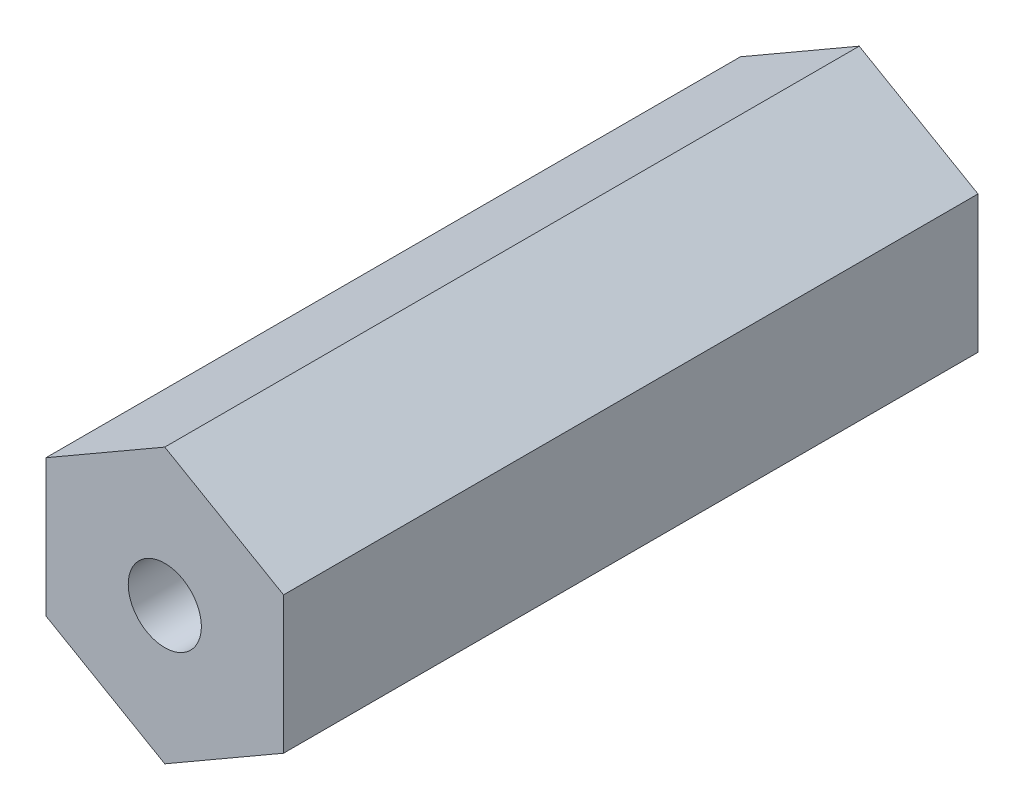
ISO-10303-21;
HEADER;
FILE_DESCRIPTION(('STEP AP214'),'2;1');
FILE_NAME('part.step','',(''),(''),'','','');
FILE_SCHEMA(('AUTOMOTIVE_DESIGN { 1 0 10303 214 1 1 1 1 }'));
ENDSEC;
DATA;
#1=APPLICATION_CONTEXT('core data for automotive mechanical design processes');
#2=APPLICATION_PROTOCOL_DEFINITION('international standard','automotive_design',2000,#1);
#3=PRODUCT_CONTEXT('',#1,'mechanical');
#4=PRODUCT('Part','Part','',(#3));
#5=PRODUCT_RELATED_PRODUCT_CATEGORY('part','',(#4));
#6=PRODUCT_DEFINITION_FORMATION('','',#4);
#7=PRODUCT_DEFINITION_CONTEXT('part definition',#1,'design');
#8=PRODUCT_DEFINITION('design','',#6,#7);
#9=PRODUCT_DEFINITION_SHAPE('','',#8);
#10=(LENGTH_UNIT() NAMED_UNIT(*) SI_UNIT(.MILLI.,.METRE.));
#11=(NAMED_UNIT(*) PLANE_ANGLE_UNIT() SI_UNIT($,.RADIAN.));
#12=(NAMED_UNIT(*) SI_UNIT($,.STERADIAN.) SOLID_ANGLE_UNIT());
#13=UNCERTAINTY_MEASURE_WITH_UNIT(LENGTH_MEASURE(1.E-05),#10,'distance_accuracy_value','');
#14=(GEOMETRIC_REPRESENTATION_CONTEXT(3) GLOBAL_UNCERTAINTY_ASSIGNED_CONTEXT((#13)) GLOBAL_UNIT_ASSIGNED_CONTEXT((#10,
#11,#12)) REPRESENTATION_CONTEXT('',''));
#15=CARTESIAN_POINT('',(0.,0.,0.));
#16=DIRECTION('',(0.,0.,1.));
#17=DIRECTION('',(1.,0.,0.));
#18=AXIS2_PLACEMENT_3D('',#15,#16,#17);
#19=CARTESIAN_POINT('',(0.,0.,60.325));
#20=DIRECTION('',(0.,0.,1.));
#21=DIRECTION('',(1.,0.,0.));
#22=AXIS2_PLACEMENT_3D('',#19,#20,#21);
#23=PLANE('',#22);
#24=DIRECTION('',(0.866025403784439,0.5,0.));
#25=VECTOR('',#24,1.);
#26=CARTESIAN_POINT('',(0.,-11.9150661804009,60.325));
#27=LINE('',#26,#25);
#28=CARTESIAN_POINT('',(0.,-11.9150661804009,60.325));
#29=VERTEX_POINT('',#28);
#30=CARTESIAN_POINT('',(10.31875,-5.95753309020045,60.325));
#31=VERTEX_POINT('',#30);
#32=EDGE_CURVE('E148',#29,#31,#27,.T.);
#33=ORIENTED_EDGE('',*,*,#32,.T.);
#34=DIRECTION('',(0.,1.,0.));
#35=VECTOR('',#34,1.);
#36=CARTESIAN_POINT('',(10.31875,-5.95753309020045,60.325));
#37=LINE('',#36,#35);
#38=CARTESIAN_POINT('',(10.31875,5.95753309020045,60.325));
#39=VERTEX_POINT('',#38);
#40=EDGE_CURVE('E96',#31,#39,#37,.T.);
#41=ORIENTED_EDGE('',*,*,#40,.T.);
#42=DIRECTION('',(-0.866025403784439,0.5,0.));
#43=VECTOR('',#42,1.);
#44=CARTESIAN_POINT('',(10.31875,5.95753309020045,60.325));
#45=LINE('',#44,#43);
#46=CARTESIAN_POINT('',(0.,11.9150661804009,60.325));
#47=VERTEX_POINT('',#46);
#48=EDGE_CURVE('E109',#39,#47,#45,.T.);
#49=ORIENTED_EDGE('',*,*,#48,.T.);
#50=DIRECTION('',(-0.866025403784439,-0.5,0.));
#51=VECTOR('',#50,1.);
#52=CARTESIAN_POINT('',(0.,11.9150661804009,60.325));
#53=LINE('',#52,#51);
#54=CARTESIAN_POINT('',(-10.31875,5.95753309020045,60.325));
#55=VERTEX_POINT('',#54);
#56=EDGE_CURVE('E103',#47,#55,#53,.T.);
#57=ORIENTED_EDGE('',*,*,#56,.T.);
#58=DIRECTION('',(0.,-1.,0.));
#59=VECTOR('',#58,1.);
#60=CARTESIAN_POINT('',(-10.31875,5.95753309020045,60.325));
#61=LINE('',#60,#59);
#62=CARTESIAN_POINT('',(-10.31875,-5.95753309020045,60.325));
#63=VERTEX_POINT('',#62);
#64=EDGE_CURVE('E107',#55,#63,#61,.T.);
#65=ORIENTED_EDGE('',*,*,#64,.T.);
#66=DIRECTION('',(0.866025403784438,-0.5,0.));
#67=VECTOR('',#66,1.);
#68=CARTESIAN_POINT('',(-10.31875,-5.95753309020045,60.325));
#69=LINE('',#68,#67);
#70=EDGE_CURVE('E59',#63,#29,#69,.T.);
#71=ORIENTED_EDGE('',*,*,#70,.T.);
#72=EDGE_LOOP('',(#33,#41,#49,#57,#65,#71));
#73=FACE_BOUND('',#72,.T.);
#74=CARTESIAN_POINT('',(0.,0.,60.325));
#75=DIRECTION('',(0.,0.,1.));
#76=DIRECTION('',(1.,0.,0.));
#77=AXIS2_PLACEMENT_3D('',#74,#75,#76);
#78=CIRCLE('',#77,3.175);
#79=CARTESIAN_POINT('',(-3.175,0.,60.325));
#80=VERTEX_POINT('',#79);
#81=EDGE_CURVE('E136',#80,#80,#78,.T.);
#82=ORIENTED_EDGE('',*,*,#81,.F.);
#83=EDGE_LOOP('',(#82));
#84=FACE_BOUND('',#83,.T.);
#85=ADVANCED_FACE('F41',(#73,#84),#23,.T.);
#86=CARTESIAN_POINT('',(0.,0.,0.));
#87=DIRECTION('',(0.,0.,1.));
#88=DIRECTION('',(1.,0.,0.));
#89=AXIS2_PLACEMENT_3D('',#86,#87,#88);
#90=PLANE('',#89);
#91=DIRECTION('',(0.866025403784439,0.5,0.));
#92=VECTOR('',#91,1.);
#93=CARTESIAN_POINT('',(0.,-11.9150661804009,0.));
#94=LINE('',#93,#92);
#95=CARTESIAN_POINT('',(0.,-11.9150661804009,0.));
#96=VERTEX_POINT('',#95);
#97=CARTESIAN_POINT('',(10.31875,-5.95753309020045,0.));
#98=VERTEX_POINT('',#97);
#99=EDGE_CURVE('E131',#96,#98,#94,.T.);
#100=ORIENTED_EDGE('',*,*,#99,.F.);
#101=DIRECTION('',(0.866025403784438,-0.5,0.));
#102=VECTOR('',#101,1.);
#103=CARTESIAN_POINT('',(-10.31875,-5.95753309020045,0.));
#104=LINE('',#103,#102);
#105=CARTESIAN_POINT('',(-10.31875,-5.95753309020045,0.));
#106=VERTEX_POINT('',#105);
#107=EDGE_CURVE('E88',#106,#96,#104,.T.);
#108=ORIENTED_EDGE('',*,*,#107,.F.);
#109=DIRECTION('',(0.,-1.,0.));
#110=VECTOR('',#109,1.);
#111=CARTESIAN_POINT('',(-10.31875,5.95753309020045,0.));
#112=LINE('',#111,#110);
#113=CARTESIAN_POINT('',(-10.31875,5.95753309020045,0.));
#114=VERTEX_POINT('',#113);
#115=EDGE_CURVE('E82',#114,#106,#112,.T.);
#116=ORIENTED_EDGE('',*,*,#115,.F.);
#117=DIRECTION('',(-0.866025403784439,-0.5,0.));
#118=VECTOR('',#117,1.);
#119=CARTESIAN_POINT('',(0.,11.9150661804009,0.));
#120=LINE('',#119,#118);
#121=CARTESIAN_POINT('',(0.,11.9150661804009,0.));
#122=VERTEX_POINT('',#121);
#123=EDGE_CURVE('E118',#122,#114,#120,.T.);
#124=ORIENTED_EDGE('',*,*,#123,.F.);
#125=DIRECTION('',(-0.866025403784439,0.5,0.));
#126=VECTOR('',#125,1.);
#127=CARTESIAN_POINT('',(10.31875,5.95753309020045,0.));
#128=LINE('',#127,#126);
#129=CARTESIAN_POINT('',(10.31875,5.95753309020045,0.));
#130=VERTEX_POINT('',#129);
#131=EDGE_CURVE('E139',#130,#122,#128,.T.);
#132=ORIENTED_EDGE('',*,*,#131,.F.);
#133=DIRECTION('',(0.,1.,0.));
#134=VECTOR('',#133,1.);
#135=CARTESIAN_POINT('',(10.31875,-5.95753309020045,0.));
#136=LINE('',#135,#134);
#137=EDGE_CURVE('E135',#98,#130,#136,.T.);
#138=ORIENTED_EDGE('',*,*,#137,.F.);
#139=EDGE_LOOP('',(#100,#108,#116,#124,#132,#138));
#140=FACE_BOUND('',#139,.T.);
#141=CARTESIAN_POINT('',(0.,0.,0.));
#142=DIRECTION('',(0.,0.,1.));
#143=DIRECTION('',(1.,0.,0.));
#144=AXIS2_PLACEMENT_3D('',#141,#142,#143);
#145=CIRCLE('',#144,3.175);
#146=CARTESIAN_POINT('',(-3.175,0.,0.));
#147=VERTEX_POINT('',#146);
#148=EDGE_CURVE('E247',#147,#147,#145,.T.);
#149=ORIENTED_EDGE('',*,*,#148,.T.);
#150=EDGE_LOOP('',(#149));
#151=FACE_BOUND('',#150,.T.);
#152=ADVANCED_FACE('F161',(#140,#151),#90,.F.);
#153=CARTESIAN_POINT('',(0.,-11.9150661804009,60.325));
#154=DIRECTION('',(-0.5,0.866025403784439,0.));
#155=DIRECTION('',(-0.866025403784439,-0.5,0.));
#156=AXIS2_PLACEMENT_3D('',#153,#154,#155);
#157=PLANE('',#156);
#158=ORIENTED_EDGE('',*,*,#99,.T.);
#159=DIRECTION('',(0.,0.,-1.));
#160=VECTOR('',#159,1.);
#161=CARTESIAN_POINT('',(10.31875,-5.95753309020045,60.325));
#162=LINE('',#161,#160);
#163=EDGE_CURVE('E11',#31,#98,#162,.T.);
#164=ORIENTED_EDGE('',*,*,#163,.F.);
#165=ORIENTED_EDGE('',*,*,#32,.F.);
#166=DIRECTION('',(0.,0.,-1.));
#167=VECTOR('',#166,1.);
#168=CARTESIAN_POINT('',(0.,-11.9150661804009,60.325));
#169=LINE('',#168,#167);
#170=EDGE_CURVE('E127',#29,#96,#169,.T.);
#171=ORIENTED_EDGE('',*,*,#170,.T.);
#172=EDGE_LOOP('',(#158,#164,#165,#171));
#173=FACE_BOUND('',#172,.T.);
#174=ADVANCED_FACE('F43',(#173),#157,.F.);
#175=CARTESIAN_POINT('',(10.31875,-5.95753309020045,60.325));
#176=DIRECTION('',(-1.,0.,0.));
#177=DIRECTION('',(0.,-1.,0.));
#178=AXIS2_PLACEMENT_3D('',#175,#176,#177);
#179=PLANE('',#178);
#180=ORIENTED_EDGE('',*,*,#137,.T.);
#181=DIRECTION('',(0.,0.,-1.));
#182=VECTOR('',#181,1.);
#183=CARTESIAN_POINT('',(10.31875,5.95753309020045,60.325));
#184=LINE('',#183,#182);
#185=EDGE_CURVE('E51',#39,#130,#184,.T.);
#186=ORIENTED_EDGE('',*,*,#185,.F.);
#187=ORIENTED_EDGE('',*,*,#40,.F.);
#188=ORIENTED_EDGE('',*,*,#163,.T.);
#189=EDGE_LOOP('',(#180,#186,#187,#188));
#190=FACE_BOUND('',#189,.T.);
#191=ADVANCED_FACE('F186',(#190),#179,.F.);
#192=CARTESIAN_POINT('',(10.31875,5.95753309020045,60.325));
#193=DIRECTION('',(-0.5,-0.866025403784439,0.));
#194=DIRECTION('',(0.866025403784439,-0.5,0.));
#195=AXIS2_PLACEMENT_3D('',#192,#193,#194);
#196=PLANE('',#195);
#197=ORIENTED_EDGE('',*,*,#131,.T.);
#198=DIRECTION('',(0.,0.,-1.));
#199=VECTOR('',#198,1.);
#200=CARTESIAN_POINT('',(0.,11.9150661804009,60.325));
#201=LINE('',#200,#199);
#202=EDGE_CURVE('E120',#47,#122,#201,.T.);
#203=ORIENTED_EDGE('',*,*,#202,.F.);
#204=ORIENTED_EDGE('',*,*,#48,.F.);
#205=ORIENTED_EDGE('',*,*,#185,.T.);
#206=EDGE_LOOP('',(#197,#203,#204,#205));
#207=FACE_BOUND('',#206,.T.);
#208=ADVANCED_FACE('F158',(#207),#196,.F.);
#209=CARTESIAN_POINT('',(0.,11.9150661804009,60.325));
#210=DIRECTION('',(0.5,-0.866025403784439,0.));
#211=DIRECTION('',(0.866025403784439,0.5,0.));
#212=AXIS2_PLACEMENT_3D('',#209,#210,#211);
#213=PLANE('',#212);
#214=ORIENTED_EDGE('',*,*,#123,.T.);
#215=DIRECTION('',(0.,0.,-1.));
#216=VECTOR('',#215,1.);
#217=CARTESIAN_POINT('',(-10.31875,5.95753309020045,60.325));
#218=LINE('',#217,#216);
#219=EDGE_CURVE('E115',#55,#114,#218,.T.);
#220=ORIENTED_EDGE('',*,*,#219,.F.);
#221=ORIENTED_EDGE('',*,*,#56,.F.);
#222=ORIENTED_EDGE('',*,*,#202,.T.);
#223=EDGE_LOOP('',(#214,#220,#221,#222));
#224=FACE_BOUND('',#223,.T.);
#225=ADVANCED_FACE('F116',(#224),#213,.F.);
#226=CARTESIAN_POINT('',(-10.31875,5.95753309020045,60.325));
#227=DIRECTION('',(1.,0.,0.));
#228=DIRECTION('',(0.,1.,0.));
#229=AXIS2_PLACEMENT_3D('',#226,#227,#228);
#230=PLANE('',#229);
#231=ORIENTED_EDGE('',*,*,#115,.T.);
#232=DIRECTION('',(0.,0.,-1.));
#233=VECTOR('',#232,1.);
#234=CARTESIAN_POINT('',(-10.31875,-5.95753309020045,60.325));
#235=LINE('',#234,#233);
#236=EDGE_CURVE('E121',#63,#106,#235,.T.);
#237=ORIENTED_EDGE('',*,*,#236,.F.);
#238=ORIENTED_EDGE('',*,*,#64,.F.);
#239=ORIENTED_EDGE('',*,*,#219,.T.);
#240=EDGE_LOOP('',(#231,#237,#238,#239));
#241=FACE_BOUND('',#240,.T.);
#242=ADVANCED_FACE('F123',(#241),#230,.F.);
#243=CARTESIAN_POINT('',(-10.31875,-5.95753309020045,60.325));
#244=DIRECTION('',(0.5,0.866025403784438,0.));
#245=DIRECTION('',(-0.866025403784439,0.5,0.));
#246=AXIS2_PLACEMENT_3D('',#243,#244,#245);
#247=PLANE('',#246);
#248=ORIENTED_EDGE('',*,*,#107,.T.);
#249=ORIENTED_EDGE('',*,*,#170,.F.);
#250=ORIENTED_EDGE('',*,*,#70,.F.);
#251=ORIENTED_EDGE('',*,*,#236,.T.);
#252=EDGE_LOOP('',(#248,#249,#250,#251));
#253=FACE_BOUND('',#252,.T.);
#254=ADVANCED_FACE('F166',(#253),#247,.F.);
#255=CARTESIAN_POINT('',(0.,0.,60.325));
#256=DIRECTION('',(0.,0.,-1.));
#257=DIRECTION('',(-1.,0.,0.));
#258=AXIS2_PLACEMENT_3D('',#255,#256,#257);
#259=CYLINDRICAL_SURFACE('',#258,3.175);
#260=CARTESIAN_POINT('',(-3.175,0.,60.325));
#261=CARTESIAN_POINT('',(-3.175,0.,59.6966145833333));
#262=CARTESIAN_POINT('',(-3.175,0.,59.0682291666667));
#263=CARTESIAN_POINT('',(-3.175,0.,57.8114583333333));
#264=CARTESIAN_POINT('',(-3.175,0.,57.1830729166667));
#265=CARTESIAN_POINT('',(-3.175,0.,55.9263020833333));
#266=CARTESIAN_POINT('',(-3.175,0.,55.2979166666667));
#267=CARTESIAN_POINT('',(-3.175,0.,54.0411458333333));
#268=CARTESIAN_POINT('',(-3.175,0.,53.4127604166667));
#269=CARTESIAN_POINT('',(-3.175,0.,52.1559895833333));
#270=CARTESIAN_POINT('',(-3.175,0.,51.5276041666667));
#271=CARTESIAN_POINT('',(-3.175,0.,50.2708333333333));
#272=CARTESIAN_POINT('',(-3.175,0.,49.6424479166667));
#273=CARTESIAN_POINT('',(-3.175,0.,48.3856770833333));
#274=CARTESIAN_POINT('',(-3.175,0.,47.7572916666667));
#275=CARTESIAN_POINT('',(-3.175,0.,46.5005208333333));
#276=CARTESIAN_POINT('',(-3.175,0.,45.8721354166667));
#277=CARTESIAN_POINT('',(-3.175,0.,44.6153645833333));
#278=CARTESIAN_POINT('',(-3.175,0.,43.9869791666667));
#279=CARTESIAN_POINT('',(-3.175,0.,42.7302083333333));
#280=CARTESIAN_POINT('',(-3.175,0.,42.1018229166667));
#281=CARTESIAN_POINT('',(-3.175,0.,40.8450520833333));
#282=CARTESIAN_POINT('',(-3.175,0.,40.2166666666667));
#283=CARTESIAN_POINT('',(-3.175,0.,38.9598958333333));
#284=CARTESIAN_POINT('',(-3.175,0.,38.3315104166667));
#285=CARTESIAN_POINT('',(-3.175,0.,37.0747395833333));
#286=CARTESIAN_POINT('',(-3.175,0.,36.4463541666667));
#287=CARTESIAN_POINT('',(-3.175,0.,35.1895833333333));
#288=CARTESIAN_POINT('',(-3.175,0.,34.5611979166667));
#289=CARTESIAN_POINT('',(-3.175,0.,33.3044270833333));
#290=CARTESIAN_POINT('',(-3.175,0.,32.6760416666667));
#291=CARTESIAN_POINT('',(-3.175,0.,31.4192708333333));
#292=CARTESIAN_POINT('',(-3.175,0.,30.7908854166667));
#293=CARTESIAN_POINT('',(-3.175,0.,29.5341145833333));
#294=CARTESIAN_POINT('',(-3.175,0.,28.9057291666667));
#295=CARTESIAN_POINT('',(-3.175,0.,27.6489583333333));
#296=CARTESIAN_POINT('',(-3.175,0.,27.0205729166667));
#297=CARTESIAN_POINT('',(-3.175,0.,25.7638020833333));
#298=CARTESIAN_POINT('',(-3.175,0.,25.1354166666667));
#299=CARTESIAN_POINT('',(-3.175,0.,23.8786458333333));
#300=CARTESIAN_POINT('',(-3.175,0.,23.2502604166667));
#301=CARTESIAN_POINT('',(-3.175,0.,21.9934895833333));
#302=CARTESIAN_POINT('',(-3.175,0.,21.3651041666667));
#303=CARTESIAN_POINT('',(-3.175,0.,20.1083333333333));
#304=CARTESIAN_POINT('',(-3.175,0.,19.4799479166667));
#305=CARTESIAN_POINT('',(-3.175,0.,18.2231770833333));
#306=CARTESIAN_POINT('',(-3.175,0.,17.5947916666667));
#307=CARTESIAN_POINT('',(-3.175,0.,16.3380208333333));
#308=CARTESIAN_POINT('',(-3.175,0.,15.7096354166667));
#309=CARTESIAN_POINT('',(-3.175,0.,14.4528645833333));
#310=CARTESIAN_POINT('',(-3.175,0.,13.8244791666667));
#311=CARTESIAN_POINT('',(-3.175,0.,12.5677083333333));
#312=CARTESIAN_POINT('',(-3.175,0.,11.9393229166667));
#313=CARTESIAN_POINT('',(-3.175,0.,10.6825520833333));
#314=CARTESIAN_POINT('',(-3.175,0.,10.0541666666667));
#315=CARTESIAN_POINT('',(-3.175,0.,8.79739583333333));
#316=CARTESIAN_POINT('',(-3.175,0.,8.16901041666667));
#317=CARTESIAN_POINT('',(-3.175,0.,6.91223958333333));
#318=CARTESIAN_POINT('',(-3.175,0.,6.28385416666667));
#319=CARTESIAN_POINT('',(-3.175,0.,5.02708333333333));
#320=CARTESIAN_POINT('',(-3.175,0.,4.39869791666666));
#321=CARTESIAN_POINT('',(-3.175,0.,3.14192708333333));
#322=CARTESIAN_POINT('',(-3.175,0.,2.51354166666667));
#323=CARTESIAN_POINT('',(-3.175,0.,1.25677083333333));
#324=CARTESIAN_POINT('',(-3.175,0.,0.628385416666666));
#325=CARTESIAN_POINT('',(-3.175,0.,0.));
#326=B_SPLINE_CURVE_WITH_KNOTS('',3,(#260,#261,#262,#263,#264,#265,#266,#267,#268,#269,#270,
#271,#272,#273,#274,#275,#276,#277,#278,#279,#280,#281,#282,#283,#284,#285,#286,#287,#288,#289,
#290,#291,#292,#293,#294,#295,#296,#297,#298,#299,#300,#301,#302,#303,#304,#305,#306,#307,#308,
#309,#310,#311,#312,#313,#314,#315,#316,#317,#318,#319,#320,#321,#322,#323,#324,#325),
.UNSPECIFIED.,.F.,.F.,(4,2,2,2,2,2,2,2,2,2,2,2,2,2,2,2,2,2,2,2,2,2,2,2,2,2,2,2,2,2,2,2,4),(0.,
1.88515625,3.7703125,5.65546875,7.540625,9.42578124999999,11.3109375,13.19609375,15.08125,
16.96640625,18.8515625,20.73671875,22.621875,24.50703125,26.3921875,28.27734375,30.1625,
32.04765625,33.9328125,35.81796875,37.703125,39.58828125,41.4734375,43.35859375,45.24375,
47.12890625,49.0140625,50.89921875,52.784375,54.66953125,56.5546875,58.43984375,60.325),.UNSPECIFIED.);
#327=EDGE_CURVE('BSEAM168',#80,#147,#326,.T.);
#328=ORIENTED_EDGE('',*,*,#81,.T.);
#329=ORIENTED_EDGE('',*,*,#148,.F.);
#330=ORIENTED_EDGE('',*,*,#327,.T.);
#331=ORIENTED_EDGE('',*,*,#327,.F.);
#332=EDGE_LOOP('',(#328,#330,#329,#331));
#333=FACE_BOUND('',#332,.T.);
#334=ADVANCED_FACE('F168',(#333),#259,.F.);
#335=CLOSED_SHELL('',(#85,#152,#174,#191,#208,#225,#242,#254,#334));
#336=MANIFOLD_SOLID_BREP('B2',#335);
#337=ADVANCED_BREP_SHAPE_REPRESENTATION('',(#18,#336),#14);
#338=SHAPE_DEFINITION_REPRESENTATION(#9,#337);
ENDSEC;
END-ISO-10303-21;
